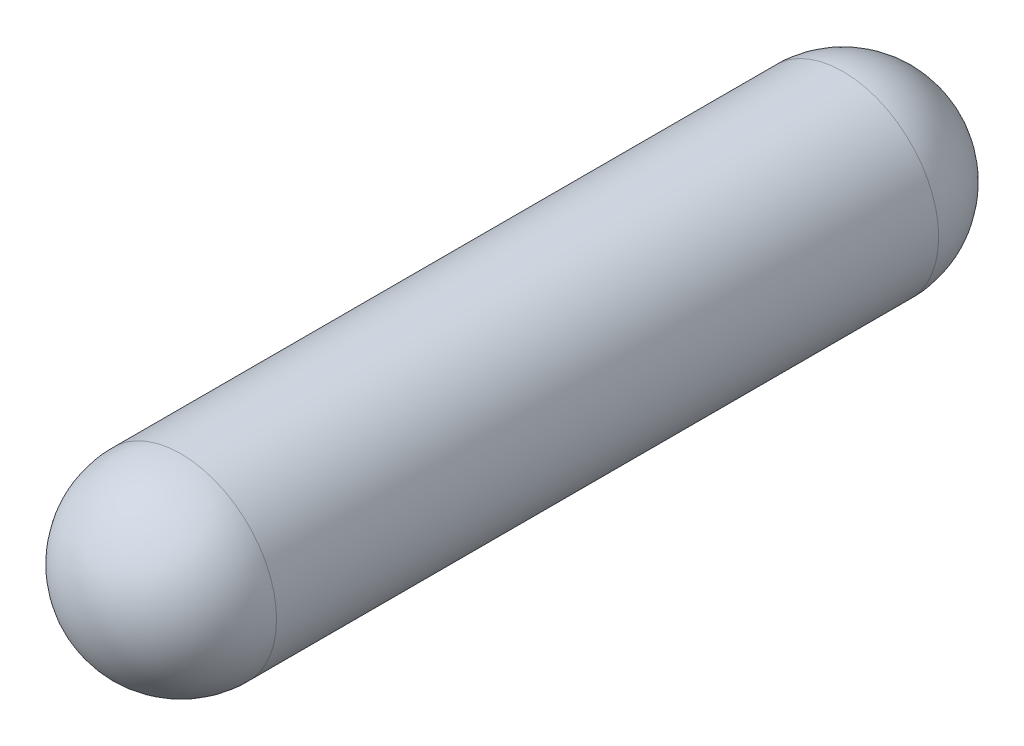
ISO-10303-21;
HEADER;
FILE_DESCRIPTION(('STEP AP214'),'2;1');
FILE_NAME('part.step','',(''),(''),'','','');
FILE_SCHEMA(('AUTOMOTIVE_DESIGN { 1 0 10303 214 1 1 1 1 }'));
ENDSEC;
DATA;
#1=APPLICATION_CONTEXT('core data for automotive mechanical design processes');
#2=APPLICATION_PROTOCOL_DEFINITION('international standard','automotive_design',2000,#1);
#3=PRODUCT_CONTEXT('',#1,'mechanical');
#4=PRODUCT('Part','Part','',(#3));
#5=PRODUCT_RELATED_PRODUCT_CATEGORY('part','',(#4));
#6=PRODUCT_DEFINITION_FORMATION('','',#4);
#7=PRODUCT_DEFINITION_CONTEXT('part definition',#1,'design');
#8=PRODUCT_DEFINITION('design','',#6,#7);
#9=PRODUCT_DEFINITION_SHAPE('','',#8);
#10=(LENGTH_UNIT() NAMED_UNIT(*) SI_UNIT(.MILLI.,.METRE.));
#11=(NAMED_UNIT(*) PLANE_ANGLE_UNIT() SI_UNIT($,.RADIAN.));
#12=(NAMED_UNIT(*) SI_UNIT($,.STERADIAN.) SOLID_ANGLE_UNIT());
#13=UNCERTAINTY_MEASURE_WITH_UNIT(LENGTH_MEASURE(1.E-05),#10,'distance_accuracy_value','');
#14=(GEOMETRIC_REPRESENTATION_CONTEXT(3) GLOBAL_UNCERTAINTY_ASSIGNED_CONTEXT((#13)) GLOBAL_UNIT_ASSIGNED_CONTEXT((#10,
#11,#12)) REPRESENTATION_CONTEXT('',''));
#15=CARTESIAN_POINT('',(0.,0.,0.));
#16=DIRECTION('',(0.,0.,1.));
#17=DIRECTION('',(1.,0.,0.));
#18=AXIS2_PLACEMENT_3D('',#15,#16,#17);
#19=CARTESIAN_POINT('',(-4.953,-9.779,-3.));
#20=DIRECTION('',(1.,0.,0.));
#21=DIRECTION('',(0.,-1.,0.));
#22=AXIS2_PLACEMENT_3D('',#19,#20,#21);
#23=SPHERICAL_SURFACE('',#22,1.5883);
#24=CARTESIAN_POINT('',(-4.953,-9.779,-3.));
#25=DIRECTION('',(0.,0.,1.));
#26=DIRECTION('',(1.,0.,0.));
#27=AXIS2_PLACEMENT_3D('',#24,#25,#26);
#28=CIRCLE('',#27,1.5883);
#29=CARTESIAN_POINT('',(-3.3647,-9.779,-3.));
#30=VERTEX_POINT('',#29);
#31=CARTESIAN_POINT('',(-6.5413,-9.779,-3.));
#32=VERTEX_POINT('',#31);
#33=EDGE_CURVE('E42',#30,#32,#28,.T.);
#34=ORIENTED_EDGE('',*,*,#33,.F.);
#35=CARTESIAN_POINT('',(-4.953,-9.779,-3.));
#36=DIRECTION('',(0.,0.,1.));
#37=DIRECTION('',(1.,0.,0.));
#38=AXIS2_PLACEMENT_3D('',#35,#36,#37);
#39=CIRCLE('',#38,1.5883);
#40=EDGE_CURVE('E26',#32,#30,#39,.T.);
#41=ORIENTED_EDGE('',*,*,#40,.F.);
#42=EDGE_LOOP('',(#34,#41));
#43=FACE_BOUND('',#42,.T.);
#44=ADVANCED_FACE('F17',(#43),#23,.T.);
#45=CARTESIAN_POINT('',(-4.953,-9.779,8.));
#46=DIRECTION('',(1.,0.,0.));
#47=DIRECTION('',(0.,1.,0.));
#48=AXIS2_PLACEMENT_3D('',#45,#46,#47);
#49=SPHERICAL_SURFACE('',#48,1.5883);
#50=CARTESIAN_POINT('',(-4.953,-9.779,8.));
#51=DIRECTION('',(0.,0.,1.));
#52=DIRECTION('',(1.,0.,0.));
#53=AXIS2_PLACEMENT_3D('',#50,#51,#52);
#54=CIRCLE('',#53,1.5883);
#55=CARTESIAN_POINT('',(-3.3647,-9.779,8.));
#56=VERTEX_POINT('',#55);
#57=CARTESIAN_POINT('',(-6.5413,-9.779,8.));
#58=VERTEX_POINT('',#57);
#59=EDGE_CURVE('E11',#56,#58,#54,.F.);
#60=ORIENTED_EDGE('',*,*,#59,.F.);
#61=CARTESIAN_POINT('',(-4.953,-9.779,8.));
#62=DIRECTION('',(0.,0.,1.));
#63=DIRECTION('',(1.,0.,0.));
#64=AXIS2_PLACEMENT_3D('',#61,#62,#63);
#65=CIRCLE('',#64,1.5883);
#66=EDGE_CURVE('E34',#58,#56,#65,.F.);
#67=ORIENTED_EDGE('',*,*,#66,.F.);
#68=EDGE_LOOP('',(#60,#67));
#69=FACE_BOUND('',#68,.T.);
#70=ADVANCED_FACE('F49',(#69),#49,.T.);
#71=CARTESIAN_POINT('',(-4.953,-9.779,-3.));
#72=DIRECTION('',(0.,0.,1.));
#73=DIRECTION('',(1.,0.,0.));
#74=AXIS2_PLACEMENT_3D('',#71,#72,#73);
#75=CYLINDRICAL_SURFACE('',#74,1.5883);
#76=ORIENTED_EDGE('',*,*,#66,.T.);
#77=ORIENTED_EDGE('',*,*,#59,.T.);
#78=EDGE_LOOP('',(#76,#77));
#79=FACE_BOUND('',#78,.T.);
#80=ORIENTED_EDGE('',*,*,#40,.T.);
#81=ORIENTED_EDGE('',*,*,#33,.T.);
#82=EDGE_LOOP('',(#80,#81));
#83=FACE_BOUND('',#82,.T.);
#84=ADVANCED_FACE('F45',(#79,#83),#75,.T.);
#85=CLOSED_SHELL('',(#44,#70,#84));
#86=MANIFOLD_SOLID_BREP('B1',#85);
#87=ADVANCED_BREP_SHAPE_REPRESENTATION('',(#18,#86),#14);
#88=SHAPE_DEFINITION_REPRESENTATION(#9,#87);
ENDSEC;
END-ISO-10303-21;
